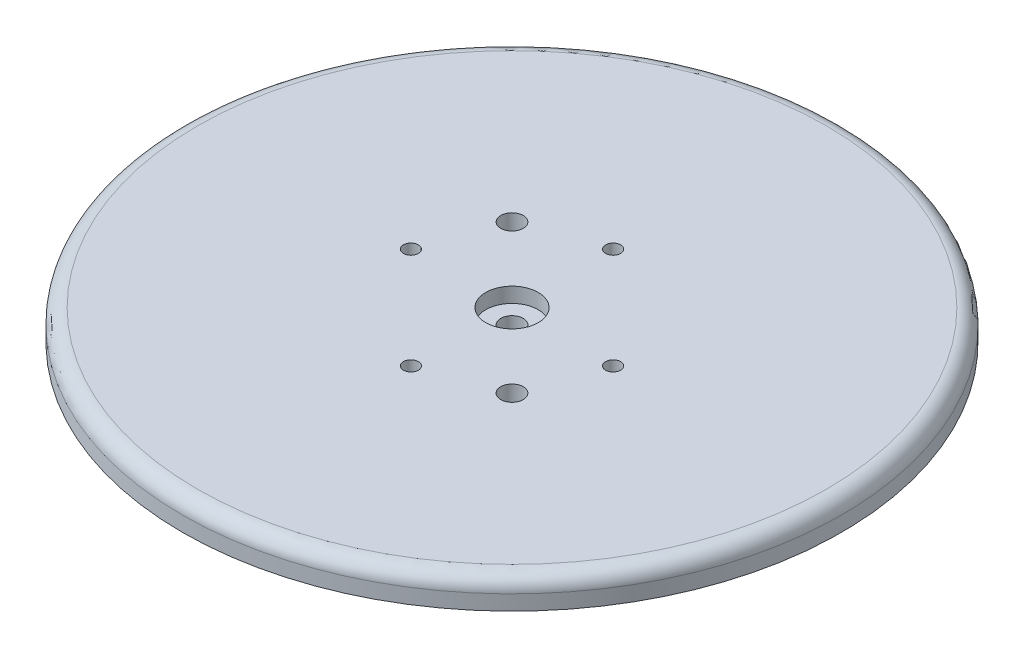
ISO-10303-21;
HEADER;
FILE_DESCRIPTION(('STEP AP214'),'2;1');
FILE_NAME('part.step','',(''),(''),'','','');
FILE_SCHEMA(('AUTOMOTIVE_DESIGN { 1 0 10303 214 1 1 1 1 }'));
ENDSEC;
DATA;
#1=APPLICATION_CONTEXT('core data for automotive mechanical design processes');
#2=APPLICATION_PROTOCOL_DEFINITION('international standard','automotive_design',2000,#1);
#3=PRODUCT_CONTEXT('',#1,'mechanical');
#4=PRODUCT('Part','Part','',(#3));
#5=PRODUCT_RELATED_PRODUCT_CATEGORY('part','',(#4));
#6=PRODUCT_DEFINITION_FORMATION('','',#4);
#7=PRODUCT_DEFINITION_CONTEXT('part definition',#1,'design');
#8=PRODUCT_DEFINITION('design','',#6,#7);
#9=PRODUCT_DEFINITION_SHAPE('','',#8);
#10=(LENGTH_UNIT() NAMED_UNIT(*) SI_UNIT(.MILLI.,.METRE.));
#11=(NAMED_UNIT(*) PLANE_ANGLE_UNIT() SI_UNIT($,.RADIAN.));
#12=(NAMED_UNIT(*) SI_UNIT($,.STERADIAN.) SOLID_ANGLE_UNIT());
#13=UNCERTAINTY_MEASURE_WITH_UNIT(LENGTH_MEASURE(1.E-05),#10,'distance_accuracy_value','');
#14=(GEOMETRIC_REPRESENTATION_CONTEXT(3) GLOBAL_UNCERTAINTY_ASSIGNED_CONTEXT((#13)) GLOBAL_UNIT_ASSIGNED_CONTEXT((#10,
#11,#12)) REPRESENTATION_CONTEXT('',''));
#15=CARTESIAN_POINT('',(0.,0.,0.));
#16=DIRECTION('',(0.,0.,1.));
#17=DIRECTION('',(1.,0.,0.));
#18=AXIS2_PLACEMENT_3D('',#15,#16,#17);
#19=CARTESIAN_POINT('',(0.,4.,0.));
#20=DIRECTION('',(0.,-1.,0.));
#21=DIRECTION('',(0.,0.,-1.));
#22=AXIS2_PLACEMENT_3D('',#19,#20,#21);
#23=CYLINDRICAL_SURFACE('',#22,44.);
#24=CARTESIAN_POINT('',(0.,2.,0.));
#25=DIRECTION('',(0.,1.,0.));
#26=DIRECTION('',(0.,0.,1.));
#27=AXIS2_PLACEMENT_3D('',#24,#25,#26);
#28=CIRCLE('',#27,44.);
#29=CARTESIAN_POINT('',(0.,2.,44.));
#30=VERTEX_POINT('',#29);
#31=EDGE_CURVE('E10',#30,#30,#28,.F.);
#32=ORIENTED_EDGE('',*,*,#31,.T.);
#33=EDGE_LOOP('',(#32));
#34=FACE_BOUND('',#33,.T.);
#35=CARTESIAN_POINT('',(0.,0.,0.));
#36=DIRECTION('',(0.,1.,0.));
#37=DIRECTION('',(0.,0.,1.));
#38=AXIS2_PLACEMENT_3D('',#35,#36,#37);
#39=CIRCLE('',#38,44.);
#40=CARTESIAN_POINT('',(0.,0.,44.));
#41=VERTEX_POINT('',#40);
#42=EDGE_CURVE('E47',#41,#41,#39,.T.);
#43=ORIENTED_EDGE('',*,*,#42,.T.);
#44=EDGE_LOOP('',(#43));
#45=FACE_BOUND('',#44,.T.);
#46=ADVANCED_FACE('F36',(#34,#45),#23,.T.);
#47=CARTESIAN_POINT('',(0.,4.,0.));
#48=DIRECTION('',(0.,1.,0.));
#49=DIRECTION('',(0.,0.,1.));
#50=AXIS2_PLACEMENT_3D('',#47,#48,#49);
#51=PLANE('',#50);
#52=CARTESIAN_POINT('',(0.,4.,0.));
#53=DIRECTION('',(0.,1.,0.));
#54=DIRECTION('',(0.,0.,1.));
#55=AXIS2_PLACEMENT_3D('',#52,#53,#54);
#56=CIRCLE('',#55,42.);
#57=CARTESIAN_POINT('',(0.,4.,42.));
#58=VERTEX_POINT('',#57);
#59=EDGE_CURVE('E43',#58,#58,#56,.T.);
#60=ORIENTED_EDGE('',*,*,#59,.T.);
#61=EDGE_LOOP('',(#60));
#62=FACE_BOUND('',#61,.T.);
#63=CARTESIAN_POINT('',(-9.89949493661167,4.,-9.89949493661166));
#64=DIRECTION('',(0.,1.,0.));
#65=DIRECTION('',(0.,0.,1.));
#66=AXIS2_PLACEMENT_3D('',#63,#64,#65);
#67=CIRCLE('',#66,1.5);
#68=CARTESIAN_POINT('',(-9.89949493661167,4.,-8.39949493661166));
#69=VERTEX_POINT('',#68);
#70=EDGE_CURVE('E96',#69,#69,#67,.T.);
#71=ORIENTED_EDGE('',*,*,#70,.F.);
#72=EDGE_LOOP('',(#71));
#73=FACE_BOUND('',#72,.T.);
#74=CARTESIAN_POINT('',(9.8994949366116,4.,9.89949493661174));
#75=DIRECTION('',(0.,1.,0.));
#76=DIRECTION('',(0.,0.,-1.));
#77=AXIS2_PLACEMENT_3D('',#74,#75,#76);
#78=CIRCLE('',#77,1.5);
#79=CARTESIAN_POINT('',(9.8994949366116,4.,8.39949493661173));
#80=VERTEX_POINT('',#79);
#81=EDGE_CURVE('E90',#80,#80,#78,.T.);
#82=ORIENTED_EDGE('',*,*,#81,.F.);
#83=EDGE_LOOP('',(#82));
#84=FACE_BOUND('',#83,.T.);
#85=CARTESIAN_POINT('',(0.,4.,-13.5));
#86=DIRECTION('',(0.,1.,0.));
#87=DIRECTION('',(0.,0.,1.));
#88=AXIS2_PLACEMENT_3D('',#85,#86,#87);
#89=CIRCLE('',#88,1.);
#90=CARTESIAN_POINT('',(0.,4.,-12.5));
#91=VERTEX_POINT('',#90);
#92=EDGE_CURVE('E79',#91,#91,#89,.T.);
#93=ORIENTED_EDGE('',*,*,#92,.F.);
#94=EDGE_LOOP('',(#93));
#95=FACE_BOUND('',#94,.T.);
#96=CARTESIAN_POINT('',(0.,4.,13.5));
#97=DIRECTION('',(0.,1.,0.));
#98=DIRECTION('',(0.,0.,-1.));
#99=AXIS2_PLACEMENT_3D('',#96,#97,#98);
#100=CIRCLE('',#99,1.);
#101=CARTESIAN_POINT('',(0.,4.,12.5));
#102=VERTEX_POINT('',#101);
#103=EDGE_CURVE('E73',#102,#102,#100,.T.);
#104=ORIENTED_EDGE('',*,*,#103,.F.);
#105=EDGE_LOOP('',(#104));
#106=FACE_BOUND('',#105,.T.);
#107=CARTESIAN_POINT('',(-13.5,4.,0.));
#108=DIRECTION('',(0.,1.,0.));
#109=DIRECTION('',(0.,0.,1.));
#110=AXIS2_PLACEMENT_3D('',#107,#108,#109);
#111=CIRCLE('',#110,1.);
#112=CARTESIAN_POINT('',(-13.5,4.,1.));
#113=VERTEX_POINT('',#112);
#114=EDGE_CURVE('E67',#113,#113,#111,.T.);
#115=ORIENTED_EDGE('',*,*,#114,.F.);
#116=EDGE_LOOP('',(#115));
#117=FACE_BOUND('',#116,.T.);
#118=CARTESIAN_POINT('',(13.5,4.,0.));
#119=DIRECTION('',(0.,1.,0.));
#120=DIRECTION('',(0.,0.,-1.));
#121=AXIS2_PLACEMENT_3D('',#118,#119,#120);
#122=CIRCLE('',#121,1.);
#123=CARTESIAN_POINT('',(13.5,4.,-1.));
#124=VERTEX_POINT('',#123);
#125=EDGE_CURVE('E60',#124,#124,#122,.T.);
#126=ORIENTED_EDGE('',*,*,#125,.F.);
#127=EDGE_LOOP('',(#126));
#128=FACE_BOUND('',#127,.T.);
#129=CARTESIAN_POINT('',(0.,4.,0.));
#130=DIRECTION('',(0.,1.,0.));
#131=DIRECTION('',(0.,0.,1.));
#132=AXIS2_PLACEMENT_3D('',#129,#130,#131);
#133=CIRCLE('',#132,3.5);
#134=CARTESIAN_POINT('',(0.,4.,3.5));
#135=VERTEX_POINT('',#134);
#136=EDGE_CURVE('E54',#135,#135,#133,.T.);
#137=ORIENTED_EDGE('',*,*,#136,.F.);
#138=EDGE_LOOP('',(#137));
#139=FACE_BOUND('',#138,.T.);
#140=ADVANCED_FACE('F112',(#62,#73,#84,#95,#106,#117,#128,#139),#51,.T.);
#141=CARTESIAN_POINT('',(0.,0.,0.));
#142=DIRECTION('',(0.,1.,0.));
#143=DIRECTION('',(0.,0.,1.));
#144=AXIS2_PLACEMENT_3D('',#141,#142,#143);
#145=PLANE('',#144);
#146=CARTESIAN_POINT('',(-9.89949493661167,0.,-9.89949493661166));
#147=DIRECTION('',(0.,1.,0.));
#148=DIRECTION('',(0.,0.,1.));
#149=AXIS2_PLACEMENT_3D('',#146,#147,#148);
#150=CIRCLE('',#149,1.5);
#151=CARTESIAN_POINT('',(-9.89949493661167,0.,-8.39949493661166));
#152=VERTEX_POINT('',#151);
#153=EDGE_CURVE('E87',#152,#152,#150,.T.);
#154=ORIENTED_EDGE('',*,*,#153,.T.);
#155=EDGE_LOOP('',(#154));
#156=FACE_BOUND('',#155,.T.);
#157=CARTESIAN_POINT('',(9.8994949366116,0.,9.89949493661174));
#158=DIRECTION('',(0.,1.,0.));
#159=DIRECTION('',(0.,0.,-1.));
#160=AXIS2_PLACEMENT_3D('',#157,#158,#159);
#161=CIRCLE('',#160,1.5);
#162=CARTESIAN_POINT('',(9.8994949366116,0.,8.39949493661173));
#163=VERTEX_POINT('',#162);
#164=EDGE_CURVE('E93',#163,#163,#161,.T.);
#165=ORIENTED_EDGE('',*,*,#164,.T.);
#166=EDGE_LOOP('',(#165));
#167=FACE_BOUND('',#166,.T.);
#168=CARTESIAN_POINT('',(0.,0.,0.));
#169=DIRECTION('',(0.,1.,0.));
#170=DIRECTION('',(0.,0.,1.));
#171=AXIS2_PLACEMENT_3D('',#168,#169,#170);
#172=CIRCLE('',#171,1.5);
#173=CARTESIAN_POINT('',(0.,0.,1.5));
#174=VERTEX_POINT('',#173);
#175=EDGE_CURVE('E64',#174,#174,#172,.T.);
#176=ORIENTED_EDGE('',*,*,#175,.T.);
#177=EDGE_LOOP('',(#176));
#178=FACE_BOUND('',#177,.T.);
#179=CARTESIAN_POINT('',(0.,0.,-13.5));
#180=DIRECTION('',(0.,1.,0.));
#181=DIRECTION('',(0.,0.,1.));
#182=AXIS2_PLACEMENT_3D('',#179,#180,#181);
#183=CIRCLE('',#182,1.);
#184=CARTESIAN_POINT('',(0.,0.,-12.5));
#185=VERTEX_POINT('',#184);
#186=EDGE_CURVE('E57',#185,#185,#183,.T.);
#187=ORIENTED_EDGE('',*,*,#186,.T.);
#188=EDGE_LOOP('',(#187));
#189=FACE_BOUND('',#188,.T.);
#190=CARTESIAN_POINT('',(0.,0.,13.5));
#191=DIRECTION('',(0.,1.,0.));
#192=DIRECTION('',(0.,0.,-1.));
#193=AXIS2_PLACEMENT_3D('',#190,#191,#192);
#194=CIRCLE('',#193,1.);
#195=CARTESIAN_POINT('',(0.,0.,12.5));
#196=VERTEX_POINT('',#195);
#197=EDGE_CURVE('E76',#196,#196,#194,.T.);
#198=ORIENTED_EDGE('',*,*,#197,.T.);
#199=EDGE_LOOP('',(#198));
#200=FACE_BOUND('',#199,.T.);
#201=CARTESIAN_POINT('',(-13.5,0.,0.));
#202=DIRECTION('',(0.,1.,0.));
#203=DIRECTION('',(0.,0.,1.));
#204=AXIS2_PLACEMENT_3D('',#201,#202,#203);
#205=CIRCLE('',#204,1.);
#206=CARTESIAN_POINT('',(-13.5,0.,1.));
#207=VERTEX_POINT('',#206);
#208=EDGE_CURVE('E70',#207,#207,#205,.T.);
#209=ORIENTED_EDGE('',*,*,#208,.T.);
#210=EDGE_LOOP('',(#209));
#211=FACE_BOUND('',#210,.T.);
#212=CARTESIAN_POINT('',(13.5,0.,0.));
#213=DIRECTION('',(0.,1.,0.));
#214=DIRECTION('',(0.,0.,-1.));
#215=AXIS2_PLACEMENT_3D('',#212,#213,#214);
#216=CIRCLE('',#215,1.);
#217=CARTESIAN_POINT('',(13.5,0.,-1.));
#218=VERTEX_POINT('',#217);
#219=EDGE_CURVE('E63',#218,#218,#216,.T.);
#220=ORIENTED_EDGE('',*,*,#219,.T.);
#221=EDGE_LOOP('',(#220));
#222=FACE_BOUND('',#221,.T.);
#223=ORIENTED_EDGE('',*,*,#42,.F.);
#224=EDGE_LOOP('',(#223));
#225=FACE_BOUND('',#224,.T.);
#226=ADVANCED_FACE('F102',(#156,#167,#178,#189,#200,#211,#222,#225),#145,.F.);
#227=CARTESIAN_POINT('',(0.,2.,0.));
#228=DIRECTION('',(0.,1.,0.));
#229=DIRECTION('',(0.,0.,1.));
#230=AXIS2_PLACEMENT_3D('',#227,#228,#229);
#231=CYLINDRICAL_SURFACE('',#230,3.5);
#232=CARTESIAN_POINT('',(0.,2.,0.));
#233=DIRECTION('',(0.,1.,0.));
#234=DIRECTION('',(0.,0.,1.));
#235=AXIS2_PLACEMENT_3D('',#232,#233,#234);
#236=CIRCLE('',#235,3.5);
#237=CARTESIAN_POINT('',(0.,2.,3.5));
#238=VERTEX_POINT('',#237);
#239=EDGE_CURVE('E51',#238,#238,#236,.T.);
#240=ORIENTED_EDGE('',*,*,#239,.F.);
#241=EDGE_LOOP('',(#240));
#242=FACE_BOUND('',#241,.T.);
#243=ORIENTED_EDGE('',*,*,#136,.T.);
#244=EDGE_LOOP('',(#243));
#245=FACE_BOUND('',#244,.T.);
#246=ADVANCED_FACE('F128',(#242,#245),#231,.F.);
#247=CARTESIAN_POINT('',(0.,2.,0.));
#248=DIRECTION('',(0.,1.,0.));
#249=DIRECTION('',(0.,0.,1.));
#250=AXIS2_PLACEMENT_3D('',#247,#248,#249);
#251=PLANE('',#250);
#252=CARTESIAN_POINT('',(0.,2.,0.));
#253=DIRECTION('',(0.,1.,0.));
#254=DIRECTION('',(0.,0.,1.));
#255=AXIS2_PLACEMENT_3D('',#252,#253,#254);
#256=CIRCLE('',#255,1.5);
#257=CARTESIAN_POINT('',(0.,2.,1.5));
#258=VERTEX_POINT('',#257);
#259=EDGE_CURVE('E84',#258,#258,#256,.T.);
#260=ORIENTED_EDGE('',*,*,#259,.F.);
#261=EDGE_LOOP('',(#260));
#262=FACE_BOUND('',#261,.T.);
#263=ORIENTED_EDGE('',*,*,#239,.T.);
#264=EDGE_LOOP('',(#263));
#265=FACE_BOUND('',#264,.T.);
#266=ADVANCED_FACE('F130',(#262,#265),#251,.T.);
#267=CARTESIAN_POINT('',(13.5,0.,0.));
#268=DIRECTION('',(0.,1.,0.));
#269=DIRECTION('',(0.,0.,1.));
#270=AXIS2_PLACEMENT_3D('',#267,#268,#269);
#271=CYLINDRICAL_SURFACE('',#270,1.);
#272=ORIENTED_EDGE('',*,*,#219,.F.);
#273=EDGE_LOOP('',(#272));
#274=FACE_BOUND('',#273,.T.);
#275=ORIENTED_EDGE('',*,*,#125,.T.);
#276=EDGE_LOOP('',(#275));
#277=FACE_BOUND('',#276,.T.);
#278=ADVANCED_FACE('F137',(#274,#277),#271,.F.);
#279=CARTESIAN_POINT('',(-13.5,0.,0.));
#280=DIRECTION('',(0.,1.,0.));
#281=DIRECTION('',(0.,0.,1.));
#282=AXIS2_PLACEMENT_3D('',#279,#280,#281);
#283=CYLINDRICAL_SURFACE('',#282,1.);
#284=ORIENTED_EDGE('',*,*,#208,.F.);
#285=EDGE_LOOP('',(#284));
#286=FACE_BOUND('',#285,.T.);
#287=ORIENTED_EDGE('',*,*,#114,.T.);
#288=EDGE_LOOP('',(#287));
#289=FACE_BOUND('',#288,.T.);
#290=ADVANCED_FACE('F196',(#286,#289),#283,.F.);
#291=CARTESIAN_POINT('',(0.,0.,13.5));
#292=DIRECTION('',(0.,1.,0.));
#293=DIRECTION('',(0.,0.,1.));
#294=AXIS2_PLACEMENT_3D('',#291,#292,#293);
#295=CYLINDRICAL_SURFACE('',#294,1.);
#296=ORIENTED_EDGE('',*,*,#197,.F.);
#297=EDGE_LOOP('',(#296));
#298=FACE_BOUND('',#297,.T.);
#299=ORIENTED_EDGE('',*,*,#103,.T.);
#300=EDGE_LOOP('',(#299));
#301=FACE_BOUND('',#300,.T.);
#302=ADVANCED_FACE('F188',(#298,#301),#295,.F.);
#303=CARTESIAN_POINT('',(0.,0.,-13.5));
#304=DIRECTION('',(0.,1.,0.));
#305=DIRECTION('',(0.,0.,1.));
#306=AXIS2_PLACEMENT_3D('',#303,#304,#305);
#307=CYLINDRICAL_SURFACE('',#306,1.);
#308=ORIENTED_EDGE('',*,*,#186,.F.);
#309=EDGE_LOOP('',(#308));
#310=FACE_BOUND('',#309,.T.);
#311=ORIENTED_EDGE('',*,*,#92,.T.);
#312=EDGE_LOOP('',(#311));
#313=FACE_BOUND('',#312,.T.);
#314=ADVANCED_FACE('F179',(#310,#313),#307,.F.);
#315=CARTESIAN_POINT('',(0.,0.,0.));
#316=DIRECTION('',(0.,1.,0.));
#317=DIRECTION('',(0.,0.,1.));
#318=AXIS2_PLACEMENT_3D('',#315,#316,#317);
#319=CYLINDRICAL_SURFACE('',#318,1.5);
#320=ORIENTED_EDGE('',*,*,#175,.F.);
#321=EDGE_LOOP('',(#320));
#322=FACE_BOUND('',#321,.T.);
#323=ORIENTED_EDGE('',*,*,#259,.T.);
#324=EDGE_LOOP('',(#323));
#325=FACE_BOUND('',#324,.T.);
#326=ADVANCED_FACE('F170',(#322,#325),#319,.F.);
#327=CARTESIAN_POINT('',(9.8994949366116,0.,9.89949493661174));
#328=DIRECTION('',(0.,1.,0.));
#329=DIRECTION('',(0.,0.,1.));
#330=AXIS2_PLACEMENT_3D('',#327,#328,#329);
#331=CYLINDRICAL_SURFACE('',#330,1.5);
#332=ORIENTED_EDGE('',*,*,#164,.F.);
#333=EDGE_LOOP('',(#332));
#334=FACE_BOUND('',#333,.T.);
#335=ORIENTED_EDGE('',*,*,#81,.T.);
#336=EDGE_LOOP('',(#335));
#337=FACE_BOUND('',#336,.T.);
#338=ADVANCED_FACE('F108',(#334,#337),#331,.F.);
#339=CARTESIAN_POINT('',(-9.89949493661167,0.,-9.89949493661166));
#340=DIRECTION('',(0.,1.,0.));
#341=DIRECTION('',(0.,0.,1.));
#342=AXIS2_PLACEMENT_3D('',#339,#340,#341);
#343=CYLINDRICAL_SURFACE('',#342,1.5);
#344=ORIENTED_EDGE('',*,*,#153,.F.);
#345=EDGE_LOOP('',(#344));
#346=FACE_BOUND('',#345,.T.);
#347=ORIENTED_EDGE('',*,*,#70,.T.);
#348=EDGE_LOOP('',(#347));
#349=FACE_BOUND('',#348,.T.);
#350=ADVANCED_FACE('F105',(#346,#349),#343,.F.);
#351=CARTESIAN_POINT('',(0.,2.,0.));
#352=DIRECTION('',(0.,1.,0.));
#353=DIRECTION('',(0.,0.,1.));
#354=AXIS2_PLACEMENT_3D('',#351,#352,#353);
#355=TOROIDAL_SURFACE('',#354,42.,2.);
#356=ORIENTED_EDGE('',*,*,#31,.F.);
#357=EDGE_LOOP('',(#356));
#358=FACE_BOUND('',#357,.T.);
#359=ORIENTED_EDGE('',*,*,#59,.F.);
#360=EDGE_LOOP('',(#359));
#361=FACE_BOUND('',#360,.T.);
#362=ADVANCED_FACE('F38',(#358,#361),#355,.T.);
#363=CLOSED_SHELL('',(#46,#140,#226,#246,#266,#278,#290,#302,#314,#326,#338,#350,#362));
#364=MANIFOLD_SOLID_BREP('B2',#363);
#365=ADVANCED_BREP_SHAPE_REPRESENTATION('',(#18,#364),#14);
#366=SHAPE_DEFINITION_REPRESENTATION(#9,#365);
ENDSEC;
END-ISO-10303-21;
